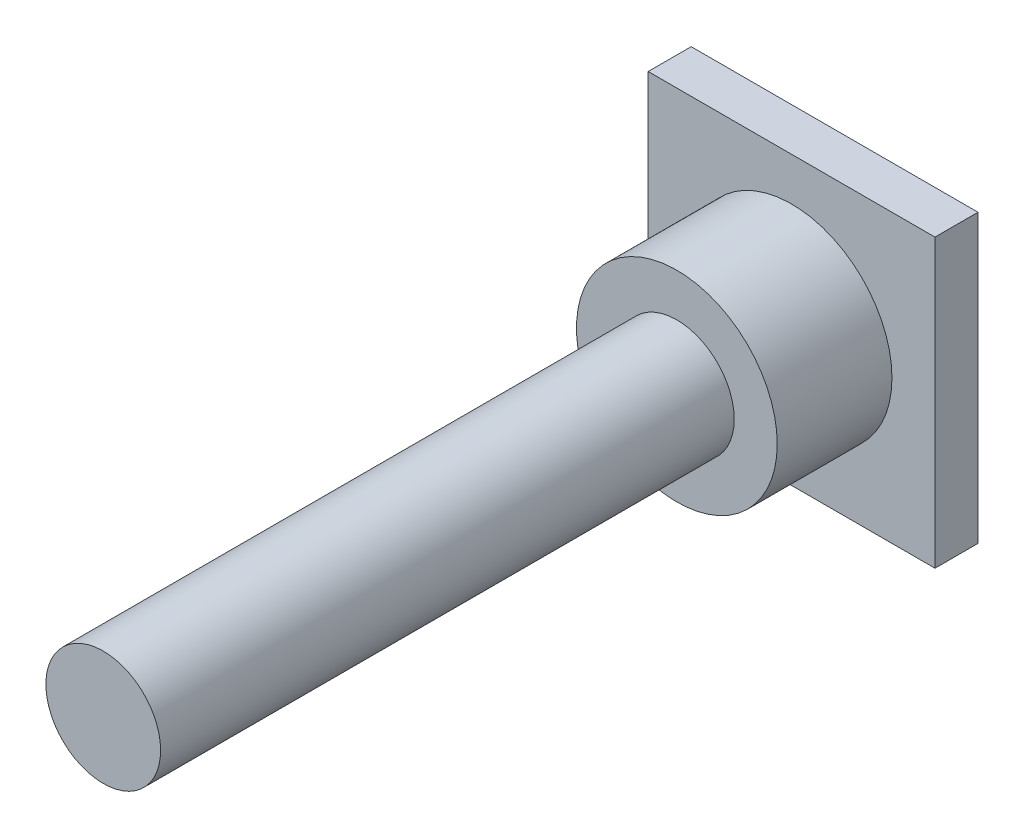
ISO-10303-21;
HEADER;
FILE_DESCRIPTION(('STEP AP214'),'2;1');
FILE_NAME('part.step','',(''),(''),'','','');
FILE_SCHEMA(('AUTOMOTIVE_DESIGN { 1 0 10303 214 1 1 1 1 }'));
ENDSEC;
DATA;
#1=APPLICATION_CONTEXT('core data for automotive mechanical design processes');
#2=APPLICATION_PROTOCOL_DEFINITION('international standard','automotive_design',2000,#1);
#3=PRODUCT_CONTEXT('',#1,'mechanical');
#4=PRODUCT('Part','Part','',(#3));
#5=PRODUCT_RELATED_PRODUCT_CATEGORY('part','',(#4));
#6=PRODUCT_DEFINITION_FORMATION('','',#4);
#7=PRODUCT_DEFINITION_CONTEXT('part definition',#1,'design');
#8=PRODUCT_DEFINITION('design','',#6,#7);
#9=PRODUCT_DEFINITION_SHAPE('','',#8);
#10=(LENGTH_UNIT() NAMED_UNIT(*) SI_UNIT(.MILLI.,.METRE.));
#11=(NAMED_UNIT(*) PLANE_ANGLE_UNIT() SI_UNIT($,.RADIAN.));
#12=(NAMED_UNIT(*) SI_UNIT($,.STERADIAN.) SOLID_ANGLE_UNIT());
#13=UNCERTAINTY_MEASURE_WITH_UNIT(LENGTH_MEASURE(1.E-05),#10,'distance_accuracy_value','');
#14=(GEOMETRIC_REPRESENTATION_CONTEXT(3) GLOBAL_UNCERTAINTY_ASSIGNED_CONTEXT((#13)) GLOBAL_UNIT_ASSIGNED_CONTEXT((#10,
#11,#12)) REPRESENTATION_CONTEXT('',''));
#15=CARTESIAN_POINT('',(0.,0.,0.));
#16=DIRECTION('',(0.,0.,1.));
#17=DIRECTION('',(1.,0.,0.));
#18=AXIS2_PLACEMENT_3D('',#15,#16,#17);
#19=CARTESIAN_POINT('',(-50.,50.,15.));
#20=DIRECTION('',(0.,-1.,0.));
#21=DIRECTION('',(1.,0.,0.));
#22=AXIS2_PLACEMENT_3D('',#19,#20,#21);
#23=PLANE('',#22);
#24=DIRECTION('',(-1.,0.,0.));
#25=VECTOR('',#24,1.);
#26=CARTESIAN_POINT('',(-50.,50.,0.));
#27=LINE('',#26,#25);
#28=CARTESIAN_POINT('',(50.,50.,0.));
#29=VERTEX_POINT('',#28);
#30=CARTESIAN_POINT('',(-50.,50.,0.));
#31=VERTEX_POINT('',#30);
#32=EDGE_CURVE('E117',#29,#31,#27,.T.);
#33=ORIENTED_EDGE('',*,*,#32,.T.);
#34=DIRECTION('',(0.,0.,-1.));
#35=VECTOR('',#34,1.);
#36=CARTESIAN_POINT('',(-50.,50.,15.));
#37=LINE('',#36,#35);
#38=CARTESIAN_POINT('',(-50.,50.,15.));
#39=VERTEX_POINT('',#38);
#40=EDGE_CURVE('E48',#39,#31,#37,.T.);
#41=ORIENTED_EDGE('',*,*,#40,.F.);
#42=DIRECTION('',(-1.,0.,0.));
#43=VECTOR('',#42,1.);
#44=CARTESIAN_POINT('',(-50.,50.,15.));
#45=LINE('',#44,#43);
#46=CARTESIAN_POINT('',(50.,50.,15.));
#47=VERTEX_POINT('',#46);
#48=EDGE_CURVE('E100',#47,#39,#45,.T.);
#49=ORIENTED_EDGE('',*,*,#48,.F.);
#50=DIRECTION('',(0.,0.,-1.));
#51=VECTOR('',#50,1.);
#52=CARTESIAN_POINT('',(50.,50.,15.));
#53=LINE('',#52,#51);
#54=EDGE_CURVE('E113',#47,#29,#53,.T.);
#55=ORIENTED_EDGE('',*,*,#54,.T.);
#56=EDGE_LOOP('',(#33,#41,#49,#55));
#57=FACE_BOUND('',#56,.T.);
#58=ADVANCED_FACE('F45',(#57),#23,.F.);
#59=CARTESIAN_POINT('',(-50.,-50.,15.));
#60=DIRECTION('',(1.,0.,0.));
#61=DIRECTION('',(0.,0.,-1.));
#62=AXIS2_PLACEMENT_3D('',#59,#60,#61);
#63=PLANE('',#62);
#64=DIRECTION('',(0.,-1.,0.));
#65=VECTOR('',#64,1.);
#66=CARTESIAN_POINT('',(-50.,-50.,0.));
#67=LINE('',#66,#65);
#68=CARTESIAN_POINT('',(-50.,-50.,0.));
#69=VERTEX_POINT('',#68);
#70=EDGE_CURVE('E106',#31,#69,#67,.T.);
#71=ORIENTED_EDGE('',*,*,#70,.T.);
#72=DIRECTION('',(0.,0.,-1.));
#73=VECTOR('',#72,1.);
#74=CARTESIAN_POINT('',(-50.,-50.,15.));
#75=LINE('',#74,#73);
#76=CARTESIAN_POINT('',(-50.,-50.,15.));
#77=VERTEX_POINT('',#76);
#78=EDGE_CURVE('E104',#77,#69,#75,.T.);
#79=ORIENTED_EDGE('',*,*,#78,.F.);
#80=DIRECTION('',(0.,-1.,0.));
#81=VECTOR('',#80,1.);
#82=CARTESIAN_POINT('',(-50.,-50.,15.));
#83=LINE('',#82,#81);
#84=EDGE_CURVE('E95',#39,#77,#83,.T.);
#85=ORIENTED_EDGE('',*,*,#84,.F.);
#86=ORIENTED_EDGE('',*,*,#40,.T.);
#87=EDGE_LOOP('',(#71,#79,#85,#86));
#88=FACE_BOUND('',#87,.T.);
#89=ADVANCED_FACE('F105',(#88),#63,.F.);
#90=CARTESIAN_POINT('',(-50.,-50.,15.));
#91=DIRECTION('',(0.,1.,0.));
#92=DIRECTION('',(-1.,0.,0.));
#93=AXIS2_PLACEMENT_3D('',#90,#91,#92);
#94=PLANE('',#93);
#95=DIRECTION('',(1.,0.,0.));
#96=VECTOR('',#95,1.);
#97=CARTESIAN_POINT('',(-50.,-50.,0.));
#98=LINE('',#97,#96);
#99=CARTESIAN_POINT('',(50.,-50.,0.));
#100=VERTEX_POINT('',#99);
#101=EDGE_CURVE('E81',#69,#100,#98,.T.);
#102=ORIENTED_EDGE('',*,*,#101,.T.);
#103=DIRECTION('',(0.,0.,-1.));
#104=VECTOR('',#103,1.);
#105=CARTESIAN_POINT('',(50.,-50.,15.));
#106=LINE('',#105,#104);
#107=CARTESIAN_POINT('',(50.,-50.,15.));
#108=VERTEX_POINT('',#107);
#109=EDGE_CURVE('E108',#108,#100,#106,.T.);
#110=ORIENTED_EDGE('',*,*,#109,.F.);
#111=DIRECTION('',(1.,0.,0.));
#112=VECTOR('',#111,1.);
#113=CARTESIAN_POINT('',(-50.,-50.,15.));
#114=LINE('',#113,#112);
#115=EDGE_CURVE('E98',#77,#108,#114,.T.);
#116=ORIENTED_EDGE('',*,*,#115,.F.);
#117=ORIENTED_EDGE('',*,*,#78,.T.);
#118=EDGE_LOOP('',(#102,#110,#116,#117));
#119=FACE_BOUND('',#118,.T.);
#120=ADVANCED_FACE('F109',(#119),#94,.F.);
#121=CARTESIAN_POINT('',(50.,-50.,15.));
#122=DIRECTION('',(-1.,0.,0.));
#123=DIRECTION('',(0.,0.,1.));
#124=AXIS2_PLACEMENT_3D('',#121,#122,#123);
#125=PLANE('',#124);
#126=DIRECTION('',(0.,1.,0.));
#127=VECTOR('',#126,1.);
#128=CARTESIAN_POINT('',(50.,-50.,0.));
#129=LINE('',#128,#127);
#130=EDGE_CURVE('E87',#100,#29,#129,.T.);
#131=ORIENTED_EDGE('',*,*,#130,.T.);
#132=ORIENTED_EDGE('',*,*,#54,.F.);
#133=DIRECTION('',(0.,1.,0.));
#134=VECTOR('',#133,1.);
#135=CARTESIAN_POINT('',(50.,-50.,15.));
#136=LINE('',#135,#134);
#137=EDGE_CURVE('E64',#108,#47,#136,.T.);
#138=ORIENTED_EDGE('',*,*,#137,.F.);
#139=ORIENTED_EDGE('',*,*,#109,.T.);
#140=EDGE_LOOP('',(#131,#132,#138,#139));
#141=FACE_BOUND('',#140,.T.);
#142=ADVANCED_FACE('F131',(#141),#125,.F.);
#143=CARTESIAN_POINT('',(0.,0.,15.));
#144=DIRECTION('',(0.,0.,1.));
#145=DIRECTION('',(1.,0.,0.));
#146=AXIS2_PLACEMENT_3D('',#143,#144,#145);
#147=PLANE('',#146);
#148=CARTESIAN_POINT('',(0.,0.,15.));
#149=DIRECTION('',(0.,0.,1.));
#150=DIRECTION('',(1.,0.,0.));
#151=AXIS2_PLACEMENT_3D('',#148,#149,#150);
#152=CIRCLE('',#151,35.);
#153=CARTESIAN_POINT('',(35.,0.,15.));
#154=VERTEX_POINT('',#153);
#155=EDGE_CURVE('E55',#154,#154,#152,.T.);
#156=ORIENTED_EDGE('',*,*,#155,.F.);
#157=EDGE_LOOP('',(#156));
#158=FACE_BOUND('',#157,.T.);
#159=ORIENTED_EDGE('',*,*,#48,.T.);
#160=ORIENTED_EDGE('',*,*,#84,.T.);
#161=ORIENTED_EDGE('',*,*,#115,.T.);
#162=ORIENTED_EDGE('',*,*,#137,.T.);
#163=EDGE_LOOP('',(#159,#160,#161,#162));
#164=FACE_BOUND('',#163,.T.);
#165=ADVANCED_FACE('F96',(#158,#164),#147,.T.);
#166=CARTESIAN_POINT('',(0.,0.,0.));
#167=DIRECTION('',(0.,0.,1.));
#168=DIRECTION('',(1.,0.,0.));
#169=AXIS2_PLACEMENT_3D('',#166,#167,#168);
#170=PLANE('',#169);
#171=ORIENTED_EDGE('',*,*,#32,.F.);
#172=ORIENTED_EDGE('',*,*,#130,.F.);
#173=ORIENTED_EDGE('',*,*,#101,.F.);
#174=ORIENTED_EDGE('',*,*,#70,.F.);
#175=EDGE_LOOP('',(#171,#172,#173,#174));
#176=FACE_BOUND('',#175,.T.);
#177=ADVANCED_FACE('F134',(#176),#170,.F.);
#178=CARTESIAN_POINT('',(0.,0.,55.));
#179=DIRECTION('',(0.,0.,-1.));
#180=DIRECTION('',(-1.,0.,0.));
#181=AXIS2_PLACEMENT_3D('',#178,#179,#180);
#182=CYLINDRICAL_SURFACE('',#181,35.);
#183=CARTESIAN_POINT('',(0.,0.,55.));
#184=DIRECTION('',(0.,0.,1.));
#185=DIRECTION('',(1.,0.,0.));
#186=AXIS2_PLACEMENT_3D('',#183,#184,#185);
#187=CIRCLE('',#186,35.);
#188=CARTESIAN_POINT('',(35.,0.,55.));
#189=VERTEX_POINT('',#188);
#190=EDGE_CURVE('E121',#189,#189,#187,.T.);
#191=ORIENTED_EDGE('',*,*,#190,.F.);
#192=EDGE_LOOP('',(#191));
#193=FACE_BOUND('',#192,.T.);
#194=ORIENTED_EDGE('',*,*,#155,.T.);
#195=EDGE_LOOP('',(#194));
#196=FACE_BOUND('',#195,.T.);
#197=ADVANCED_FACE('F160',(#193,#196),#182,.T.);
#198=CARTESIAN_POINT('',(0.,0.,55.));
#199=DIRECTION('',(0.,0.,1.));
#200=DIRECTION('',(1.,0.,0.));
#201=AXIS2_PLACEMENT_3D('',#198,#199,#200);
#202=PLANE('',#201);
#203=CARTESIAN_POINT('',(0.,0.,55.));
#204=DIRECTION('',(0.,0.,1.));
#205=DIRECTION('',(1.,0.,0.));
#206=AXIS2_PLACEMENT_3D('',#203,#204,#205);
#207=CIRCLE('',#206,20.);
#208=CARTESIAN_POINT('',(20.,0.,55.));
#209=VERTEX_POINT('',#208);
#210=EDGE_CURVE('E11',#209,#209,#207,.T.);
#211=ORIENTED_EDGE('',*,*,#210,.F.);
#212=EDGE_LOOP('',(#211));
#213=FACE_BOUND('',#212,.T.);
#214=ORIENTED_EDGE('',*,*,#190,.T.);
#215=EDGE_LOOP('',(#214));
#216=FACE_BOUND('',#215,.T.);
#217=ADVANCED_FACE('F154',(#213,#216),#202,.T.);
#218=CARTESIAN_POINT('',(0.,0.,255.));
#219=DIRECTION('',(0.,0.,-1.));
#220=DIRECTION('',(-1.,0.,0.));
#221=AXIS2_PLACEMENT_3D('',#218,#219,#220);
#222=CYLINDRICAL_SURFACE('',#221,20.);
#223=CARTESIAN_POINT('',(0.,0.,255.));
#224=DIRECTION('',(0.,0.,1.));
#225=DIRECTION('',(1.,0.,0.));
#226=AXIS2_PLACEMENT_3D('',#223,#224,#225);
#227=CIRCLE('',#226,20.);
#228=CARTESIAN_POINT('',(20.,0.,255.));
#229=VERTEX_POINT('',#228);
#230=EDGE_CURVE('E143',#229,#229,#227,.T.);
#231=ORIENTED_EDGE('',*,*,#230,.F.);
#232=EDGE_LOOP('',(#231));
#233=FACE_BOUND('',#232,.T.);
#234=ORIENTED_EDGE('',*,*,#210,.T.);
#235=EDGE_LOOP('',(#234));
#236=FACE_BOUND('',#235,.T.);
#237=ADVANCED_FACE('F151',(#233,#236),#222,.T.);
#238=CARTESIAN_POINT('',(0.,0.,255.));
#239=DIRECTION('',(0.,0.,1.));
#240=DIRECTION('',(1.,0.,0.));
#241=AXIS2_PLACEMENT_3D('',#238,#239,#240);
#242=PLANE('',#241);
#243=ORIENTED_EDGE('',*,*,#230,.T.);
#244=EDGE_LOOP('',(#243));
#245=FACE_BOUND('',#244,.T.);
#246=ADVANCED_FACE('F149',(#245),#242,.T.);
#247=CLOSED_SHELL('',(#58,#89,#120,#142,#165,#177,#197,#217,#237,#246));
#248=MANIFOLD_SOLID_BREP('B2',#247);
#249=ADVANCED_BREP_SHAPE_REPRESENTATION('',(#18,#248),#14);
#250=SHAPE_DEFINITION_REPRESENTATION(#9,#249);
ENDSEC;
END-ISO-10303-21;
